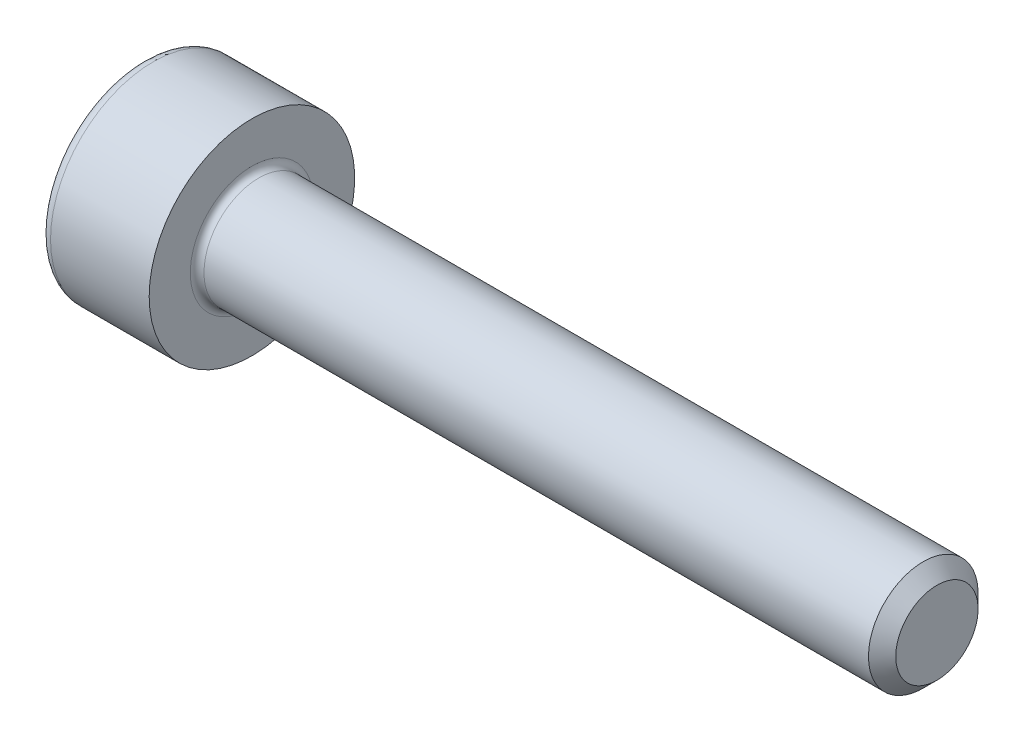
ISO-10303-21;
HEADER;
FILE_DESCRIPTION(('STEP AP214'),'2;1');
FILE_NAME('part.step','',(''),(''),'','','');
FILE_SCHEMA(('AUTOMOTIVE_DESIGN { 1 0 10303 214 1 1 1 1 }'));
ENDSEC;
DATA;
#1=APPLICATION_CONTEXT('core data for automotive mechanical design processes');
#2=APPLICATION_PROTOCOL_DEFINITION('international standard','automotive_design',2000,#1);
#3=PRODUCT_CONTEXT('',#1,'mechanical');
#4=PRODUCT('Part','Part','',(#3));
#5=PRODUCT_RELATED_PRODUCT_CATEGORY('part','',(#4));
#6=PRODUCT_DEFINITION_FORMATION('','',#4);
#7=PRODUCT_DEFINITION_CONTEXT('part definition',#1,'design');
#8=PRODUCT_DEFINITION('design','',#6,#7);
#9=PRODUCT_DEFINITION_SHAPE('','',#8);
#10=(LENGTH_UNIT() NAMED_UNIT(*) SI_UNIT(.MILLI.,.METRE.));
#11=(NAMED_UNIT(*) PLANE_ANGLE_UNIT() SI_UNIT($,.RADIAN.));
#12=(NAMED_UNIT(*) SI_UNIT($,.STERADIAN.) SOLID_ANGLE_UNIT());
#13=UNCERTAINTY_MEASURE_WITH_UNIT(LENGTH_MEASURE(1.E-05),#10,'distance_accuracy_value','');
#14=(GEOMETRIC_REPRESENTATION_CONTEXT(3) GLOBAL_UNCERTAINTY_ASSIGNED_CONTEXT((#13)) GLOBAL_UNIT_ASSIGNED_CONTEXT((#10,
#11,#12)) REPRESENTATION_CONTEXT('',''));
#15=CARTESIAN_POINT('',(0.,0.,0.));
#16=DIRECTION('',(0.,0.,1.));
#17=DIRECTION('',(1.,0.,0.));
#18=AXIS2_PLACEMENT_3D('',#15,#16,#17);
#19=CARTESIAN_POINT('',(0.,0.,0.));
#20=DIRECTION('',(-1.,0.,0.));
#21=DIRECTION('',(0.,0.,1.));
#22=AXIS2_PLACEMENT_3D('',#19,#20,#21);
#23=PLANE('',#22);
#24=DIRECTION('',(0.,-0.499999999999998,0.866025403784439));
#25=VECTOR('',#24,1.);
#26=CARTESIAN_POINT('',(0.,0.877572409168226,0.));
#27=LINE('',#26,#25);
#28=CARTESIAN_POINT('',(0.,0.877572409168226,0.));
#29=VERTEX_POINT('',#28);
#30=CARTESIAN_POINT('',(0.,0.438786204584112,0.759999999999998));
#31=VERTEX_POINT('',#30);
#32=EDGE_CURVE('E261',#29,#31,#27,.T.);
#33=ORIENTED_EDGE('',*,*,#32,.T.);
#34=DIRECTION('',(0.,1.,0.));
#35=VECTOR('',#34,1.);
#36=CARTESIAN_POINT('',(0.,-0.43878620458412,0.76));
#37=LINE('',#36,#35);
#38=CARTESIAN_POINT('',(0.,-0.43878620458412,0.76));
#39=VERTEX_POINT('',#38);
#40=EDGE_CURVE('E133',#39,#31,#37,.T.);
#41=ORIENTED_EDGE('',*,*,#40,.F.);
#42=DIRECTION('',(0.,-0.500000000000001,-0.866025403784438));
#43=VECTOR('',#42,1.);
#44=CARTESIAN_POINT('',(0.,-0.43878620458412,0.76));
#45=LINE('',#44,#43);
#46=CARTESIAN_POINT('',(0.,-0.877572409168237,0.));
#47=VERTEX_POINT('',#46);
#48=EDGE_CURVE('E264',#39,#47,#45,.T.);
#49=ORIENTED_EDGE('',*,*,#48,.T.);
#50=DIRECTION('',(0.,0.499999999999998,-0.866025403784439));
#51=VECTOR('',#50,1.);
#52=CARTESIAN_POINT('',(0.,-0.877572409168237,0.));
#53=LINE('',#52,#51);
#54=CARTESIAN_POINT('',(0.,-0.438786204584122,-0.760000000000002));
#55=VERTEX_POINT('',#54);
#56=EDGE_CURVE('E267',#47,#55,#53,.T.);
#57=ORIENTED_EDGE('',*,*,#56,.T.);
#58=DIRECTION('',(0.,-1.,0.));
#59=VECTOR('',#58,1.);
#60=CARTESIAN_POINT('',(0.,0.438786204584109,-0.760000000000003));
#61=LINE('',#60,#59);
#62=CARTESIAN_POINT('',(0.,0.438786204584109,-0.760000000000003));
#63=VERTEX_POINT('',#62);
#64=EDGE_CURVE('E270',#63,#55,#61,.T.);
#65=ORIENTED_EDGE('',*,*,#64,.F.);
#66=DIRECTION('',(0.,-0.500000000000001,-0.866025403784438));
#67=VECTOR('',#66,1.);
#68=CARTESIAN_POINT('',(0.,0.877572409168226,0.));
#69=LINE('',#68,#67);
#70=EDGE_CURVE('E128',#29,#63,#69,.T.);
#71=ORIENTED_EDGE('',*,*,#70,.F.);
#72=EDGE_LOOP('',(#33,#41,#49,#57,#65,#71));
#73=FACE_BOUND('',#72,.T.);
#74=CARTESIAN_POINT('',(0.,0.,0.));
#75=DIRECTION('',(-1.,0.,0.));
#76=DIRECTION('',(0.,0.,1.));
#77=AXIS2_PLACEMENT_3D('',#74,#75,#76);
#78=CIRCLE('',#77,1.34);
#79=CARTESIAN_POINT('',(0.,0.,1.34));
#80=VERTEX_POINT('',#79);
#81=EDGE_CURVE('E45',#80,#80,#78,.T.);
#82=ORIENTED_EDGE('',*,*,#81,.T.);
#83=EDGE_LOOP('',(#82));
#84=FACE_BOUND('',#83,.T.);
#85=ADVANCED_FACE('F37',(#73,#84),#23,.T.);
#86=CARTESIAN_POINT('',(-31.75,0.,0.));
#87=DIRECTION('',(-1.,0.,0.));
#88=DIRECTION('',(0.,0.,1.));
#89=AXIS2_PLACEMENT_3D('',#86,#87,#88);
#90=CYLINDRICAL_SURFACE('',#89,1.5);
#91=CARTESIAN_POINT('',(0.16,0.,0.));
#92=DIRECTION('',(-1.,0.,0.));
#93=DIRECTION('',(0.,0.,1.));
#94=AXIS2_PLACEMENT_3D('',#91,#92,#93);
#95=CIRCLE('',#94,1.5);
#96=CARTESIAN_POINT('',(0.16,0.,1.5));
#97=VERTEX_POINT('',#96);
#98=EDGE_CURVE('E11',#97,#97,#95,.F.);
#99=ORIENTED_EDGE('',*,*,#98,.T.);
#100=EDGE_LOOP('',(#99));
#101=FACE_BOUND('',#100,.T.);
#102=CARTESIAN_POINT('',(1.6,0.,0.));
#103=DIRECTION('',(-1.,0.,0.));
#104=DIRECTION('',(0.,0.,1.));
#105=AXIS2_PLACEMENT_3D('',#102,#103,#104);
#106=CIRCLE('',#105,1.5);
#107=CARTESIAN_POINT('',(1.6,0.,1.5));
#108=VERTEX_POINT('',#107);
#109=EDGE_CURVE('E151',#108,#108,#106,.T.);
#110=ORIENTED_EDGE('',*,*,#109,.T.);
#111=EDGE_LOOP('',(#110));
#112=FACE_BOUND('',#111,.T.);
#113=ADVANCED_FACE('F175',(#101,#112),#90,.T.);
#114=CARTESIAN_POINT('',(1.6,1.5,0.));
#115=DIRECTION('',(1.,0.,0.));
#116=DIRECTION('',(0.,0.,-1.));
#117=AXIS2_PLACEMENT_3D('',#114,#115,#116);
#118=PLANE('',#117);
#119=CARTESIAN_POINT('',(1.6,0.,0.));
#120=DIRECTION('',(1.,0.,0.));
#121=DIRECTION('',(0.,0.,-1.));
#122=AXIS2_PLACEMENT_3D('',#119,#120,#121);
#123=CIRCLE('',#122,0.899999999999996);
#124=CARTESIAN_POINT('',(1.6,0.,-0.899999999999996));
#125=VERTEX_POINT('',#124);
#126=EDGE_CURVE('E154',#125,#125,#123,.F.);
#127=ORIENTED_EDGE('',*,*,#126,.T.);
#128=EDGE_LOOP('',(#127));
#129=FACE_BOUND('',#128,.T.);
#130=ORIENTED_EDGE('',*,*,#109,.F.);
#131=EDGE_LOOP('',(#130));
#132=FACE_BOUND('',#131,.T.);
#133=ADVANCED_FACE('F181',(#129,#132),#118,.T.);
#134=CARTESIAN_POINT('',(-31.75,0.,0.));
#135=DIRECTION('',(-1.,0.,0.));
#136=DIRECTION('',(0.,0.,1.));
#137=AXIS2_PLACEMENT_3D('',#134,#135,#136);
#138=CYLINDRICAL_SURFACE('',#137,0.799999999999996);
#139=CARTESIAN_POINT('',(1.7,0.,0.));
#140=DIRECTION('',(1.,0.,0.));
#141=DIRECTION('',(0.,0.,-1.));
#142=AXIS2_PLACEMENT_3D('',#139,#140,#141);
#143=CIRCLE('',#142,0.799999999999996);
#144=CARTESIAN_POINT('',(1.7,0.,-0.799999999999996));
#145=VERTEX_POINT('',#144);
#146=EDGE_CURVE('E157',#145,#145,#143,.T.);
#147=ORIENTED_EDGE('',*,*,#146,.T.);
#148=EDGE_LOOP('',(#147));
#149=FACE_BOUND('',#148,.T.);
#150=CARTESIAN_POINT('',(11.401,0.,0.));
#151=DIRECTION('',(-1.,0.,0.));
#152=DIRECTION('',(0.,0.,1.));
#153=AXIS2_PLACEMENT_3D('',#150,#151,#152);
#154=CIRCLE('',#153,0.799999999999993);
#155=CARTESIAN_POINT('',(11.401,0.,0.799999999999993));
#156=VERTEX_POINT('',#155);
#157=EDGE_CURVE('E148',#156,#156,#154,.T.);
#158=ORIENTED_EDGE('',*,*,#157,.T.);
#159=EDGE_LOOP('',(#158));
#160=FACE_BOUND('',#159,.T.);
#161=ADVANCED_FACE('F187',(#149,#160),#138,.T.);
#162=CARTESIAN_POINT('',(11.6,0.,0.));
#163=DIRECTION('',(-1.,0.,0.));
#164=DIRECTION('',(0.,0.,1.));
#165=AXIS2_PLACEMENT_3D('',#162,#163,#164);
#166=CONICAL_SURFACE('',#165,0.601,0.785398163397419);
#167=ORIENTED_EDGE('',*,*,#157,.F.);
#168=EDGE_LOOP('',(#167));
#169=FACE_BOUND('',#168,.T.);
#170=CARTESIAN_POINT('',(11.6,0.,0.));
#171=DIRECTION('',(-1.,0.,0.));
#172=DIRECTION('',(0.,0.,1.));
#173=AXIS2_PLACEMENT_3D('',#170,#171,#172);
#174=CIRCLE('',#173,0.601);
#175=CARTESIAN_POINT('',(11.6,0.,0.601));
#176=VERTEX_POINT('',#175);
#177=EDGE_CURVE('E144',#176,#176,#174,.T.);
#178=ORIENTED_EDGE('',*,*,#177,.T.);
#179=EDGE_LOOP('',(#178));
#180=FACE_BOUND('',#179,.T.);
#181=ADVANCED_FACE('F191',(#169,#180),#166,.T.);
#182=CARTESIAN_POINT('',(11.6,0.601,0.));
#183=DIRECTION('',(1.,0.,0.));
#184=DIRECTION('',(0.,0.,-1.));
#185=AXIS2_PLACEMENT_3D('',#182,#183,#184);
#186=PLANE('',#185);
#187=ORIENTED_EDGE('',*,*,#177,.F.);
#188=EDGE_LOOP('',(#187));
#189=FACE_BOUND('',#188,.T.);
#190=ADVANCED_FACE('F171',(#189),#186,.T.);
#191=CARTESIAN_POINT('',(1.7,0.,0.));
#192=DIRECTION('',(1.,0.,0.));
#193=DIRECTION('',(0.,0.,-1.));
#194=AXIS2_PLACEMENT_3D('',#191,#192,#193);
#195=TOROIDAL_SURFACE('',#194,0.899999999999996,0.1);
#196=ORIENTED_EDGE('',*,*,#146,.F.);
#197=EDGE_LOOP('',(#196));
#198=FACE_BOUND('',#197,.T.);
#199=ORIENTED_EDGE('',*,*,#126,.F.);
#200=EDGE_LOOP('',(#199));
#201=FACE_BOUND('',#200,.T.);
#202=ADVANCED_FACE('F164',(#198,#201),#195,.F.);
#203=CARTESIAN_POINT('',(0.16,0.,0.));
#204=DIRECTION('',(-1.,0.,0.));
#205=DIRECTION('',(0.,0.,1.));
#206=AXIS2_PLACEMENT_3D('',#203,#204,#205);
#207=TOROIDAL_SURFACE('',#206,1.34,0.16);
#208=ORIENTED_EDGE('',*,*,#98,.F.);
#209=EDGE_LOOP('',(#208));
#210=FACE_BOUND('',#209,.T.);
#211=ORIENTED_EDGE('',*,*,#81,.F.);
#212=EDGE_LOOP('',(#211));
#213=FACE_BOUND('',#212,.T.);
#214=ADVANCED_FACE('F39',(#210,#213),#207,.T.);
#215=CARTESIAN_POINT('',(0.7,0.877572409168226,0.));
#216=DIRECTION('',(0.,-0.86602540378444,-0.499999999999998));
#217=DIRECTION('',(0.,0.499999999999998,-0.86602540378444));
#218=AXIS2_PLACEMENT_3D('',#215,#216,#217);
#219=PLANE('',#218);
#220=ORIENTED_EDGE('',*,*,#32,.F.);
#221=DIRECTION('',(-1.,0.,0.));
#222=VECTOR('',#221,1.);
#223=CARTESIAN_POINT('',(0.7,0.877572409168226,0.));
#224=LINE('',#223,#222);
#225=CARTESIAN_POINT('',(0.7,0.877572409168226,0.));
#226=VERTEX_POINT('',#225);
#227=EDGE_CURVE('E251',#226,#29,#224,.T.);
#228=ORIENTED_EDGE('',*,*,#227,.F.);
#229=DIRECTION('',(0.,-0.499999999999998,0.866025403784439));
#230=VECTOR('',#229,1.);
#231=CARTESIAN_POINT('',(0.7,0.877572409168226,0.));
#232=LINE('',#231,#230);
#233=CARTESIAN_POINT('',(0.7,0.65817930687617,0.379999999999996));
#234=VERTEX_POINT('',#233);
#235=EDGE_CURVE('E120',#226,#234,#232,.T.);
#236=ORIENTED_EDGE('',*,*,#235,.T.);
#237=CARTESIAN_POINT('',(0.7,0.438786204584112,0.759999999999998));
#238=VERTEX_POINT('',#237);
#239=EDGE_CURVE('E111',#234,#238,#232,.T.);
#240=ORIENTED_EDGE('',*,*,#239,.T.);
#241=DIRECTION('',(-1.,0.,0.));
#242=VECTOR('',#241,1.);
#243=CARTESIAN_POINT('',(0.7,0.438786204584112,0.759999999999998));
#244=LINE('',#243,#242);
#245=EDGE_CURVE('E125',#238,#31,#244,.T.);
#246=ORIENTED_EDGE('',*,*,#245,.T.);
#247=EDGE_LOOP('',(#220,#228,#236,#240,#246));
#248=FACE_BOUND('',#247,.T.);
#249=ADVANCED_FACE('F124',(#248),#219,.T.);
#250=CARTESIAN_POINT('',(0.7,-0.43878620458412,0.76));
#251=DIRECTION('',(0.,0.,1.));
#252=DIRECTION('',(0.,-1.,0.));
#253=AXIS2_PLACEMENT_3D('',#250,#251,#252);
#254=PLANE('',#253);
#255=ORIENTED_EDGE('',*,*,#40,.T.);
#256=ORIENTED_EDGE('',*,*,#245,.F.);
#257=DIRECTION('',(0.,1.,0.));
#258=VECTOR('',#257,1.);
#259=CARTESIAN_POINT('',(0.7,-0.43878620458412,0.76));
#260=LINE('',#259,#258);
#261=CARTESIAN_POINT('',(0.7,0.,0.759999999999999));
#262=VERTEX_POINT('',#261);
#263=EDGE_CURVE('E108',#262,#238,#260,.T.);
#264=ORIENTED_EDGE('',*,*,#263,.F.);
#265=CARTESIAN_POINT('',(0.7,-0.43878620458412,0.76));
#266=VERTEX_POINT('',#265);
#267=EDGE_CURVE('E119',#266,#262,#260,.T.);
#268=ORIENTED_EDGE('',*,*,#267,.F.);
#269=DIRECTION('',(-1.,0.,0.));
#270=VECTOR('',#269,1.);
#271=CARTESIAN_POINT('',(0.7,-0.43878620458412,0.76));
#272=LINE('',#271,#270);
#273=EDGE_CURVE('E135',#266,#39,#272,.T.);
#274=ORIENTED_EDGE('',*,*,#273,.T.);
#275=EDGE_LOOP('',(#255,#256,#264,#268,#274));
#276=FACE_BOUND('',#275,.T.);
#277=ADVANCED_FACE('F130',(#276),#254,.F.);
#278=CARTESIAN_POINT('',(0.7,-0.43878620458412,0.76));
#279=DIRECTION('',(0.,0.866025403784438,-0.500000000000001));
#280=DIRECTION('',(0.,0.500000000000001,0.866025403784438));
#281=AXIS2_PLACEMENT_3D('',#278,#279,#280);
#282=PLANE('',#281);
#283=ORIENTED_EDGE('',*,*,#48,.F.);
#284=ORIENTED_EDGE('',*,*,#273,.F.);
#285=DIRECTION('',(0.,-0.500000000000001,-0.866025403784438));
#286=VECTOR('',#285,1.);
#287=CARTESIAN_POINT('',(0.7,-0.43878620458412,0.76));
#288=LINE('',#287,#286);
#289=CARTESIAN_POINT('',(0.7,-0.658179306876177,0.380000000000003));
#290=VERTEX_POINT('',#289);
#291=EDGE_CURVE('E290',#266,#290,#288,.T.);
#292=ORIENTED_EDGE('',*,*,#291,.T.);
#293=CARTESIAN_POINT('',(0.7,-0.877572409168237,0.));
#294=VERTEX_POINT('',#293);
#295=EDGE_CURVE('E279',#290,#294,#288,.T.);
#296=ORIENTED_EDGE('',*,*,#295,.T.);
#297=DIRECTION('',(-1.,0.,0.));
#298=VECTOR('',#297,1.);
#299=CARTESIAN_POINT('',(0.7,-0.877572409168237,0.));
#300=LINE('',#299,#298);
#301=EDGE_CURVE('E140',#294,#47,#300,.T.);
#302=ORIENTED_EDGE('',*,*,#301,.T.);
#303=EDGE_LOOP('',(#283,#284,#292,#296,#302));
#304=FACE_BOUND('',#303,.T.);
#305=ADVANCED_FACE('F205',(#304),#282,.T.);
#306=CARTESIAN_POINT('',(0.7,-0.877572409168237,0.));
#307=DIRECTION('',(0.,0.86602540378444,0.499999999999998));
#308=DIRECTION('',(0.,-0.499999999999998,0.86602540378444));
#309=AXIS2_PLACEMENT_3D('',#306,#307,#308);
#310=PLANE('',#309);
#311=ORIENTED_EDGE('',*,*,#56,.F.);
#312=ORIENTED_EDGE('',*,*,#301,.F.);
#313=DIRECTION('',(0.,0.499999999999998,-0.866025403784439));
#314=VECTOR('',#313,1.);
#315=CARTESIAN_POINT('',(0.7,-0.877572409168237,0.));
#316=LINE('',#315,#314);
#317=CARTESIAN_POINT('',(0.7,-0.658179306876179,-0.380000000000002));
#318=VERTEX_POINT('',#317);
#319=EDGE_CURVE('E257',#294,#318,#316,.T.);
#320=ORIENTED_EDGE('',*,*,#319,.T.);
#321=CARTESIAN_POINT('',(0.7,-0.438786204584122,-0.760000000000002));
#322=VERTEX_POINT('',#321);
#323=EDGE_CURVE('E289',#318,#322,#316,.T.);
#324=ORIENTED_EDGE('',*,*,#323,.T.);
#325=DIRECTION('',(-1.,0.,0.));
#326=VECTOR('',#325,1.);
#327=CARTESIAN_POINT('',(0.7,-0.438786204584122,-0.760000000000002));
#328=LINE('',#327,#326);
#329=EDGE_CURVE('E250',#322,#55,#328,.T.);
#330=ORIENTED_EDGE('',*,*,#329,.T.);
#331=EDGE_LOOP('',(#311,#312,#320,#324,#330));
#332=FACE_BOUND('',#331,.T.);
#333=ADVANCED_FACE('F208',(#332),#310,.T.);
#334=CARTESIAN_POINT('',(0.7,0.438786204584109,-0.760000000000003));
#335=DIRECTION('',(0.,0.,-1.));
#336=DIRECTION('',(0.,1.,0.));
#337=AXIS2_PLACEMENT_3D('',#334,#335,#336);
#338=PLANE('',#337);
#339=ORIENTED_EDGE('',*,*,#64,.T.);
#340=ORIENTED_EDGE('',*,*,#329,.F.);
#341=DIRECTION('',(0.,-1.,0.));
#342=VECTOR('',#341,1.);
#343=CARTESIAN_POINT('',(0.7,0.438786204584109,-0.760000000000003));
#344=LINE('',#343,#342);
#345=CARTESIAN_POINT('',(0.7,0.,-0.76));
#346=VERTEX_POINT('',#345);
#347=EDGE_CURVE('E254',#346,#322,#344,.T.);
#348=ORIENTED_EDGE('',*,*,#347,.F.);
#349=CARTESIAN_POINT('',(0.7,0.438786204584109,-0.760000000000003));
#350=VERTEX_POINT('',#349);
#351=EDGE_CURVE('E52',#350,#346,#344,.T.);
#352=ORIENTED_EDGE('',*,*,#351,.F.);
#353=DIRECTION('',(-1.,0.,0.));
#354=VECTOR('',#353,1.);
#355=CARTESIAN_POINT('',(0.7,0.438786204584109,-0.760000000000003));
#356=LINE('',#355,#354);
#357=EDGE_CURVE('E247',#350,#63,#356,.T.);
#358=ORIENTED_EDGE('',*,*,#357,.T.);
#359=EDGE_LOOP('',(#339,#340,#348,#352,#358));
#360=FACE_BOUND('',#359,.T.);
#361=ADVANCED_FACE('F212',(#360),#338,.F.);
#362=CARTESIAN_POINT('',(0.7,0.877572409168226,0.));
#363=DIRECTION('',(0.,0.866025403784438,-0.500000000000001));
#364=DIRECTION('',(0.,0.500000000000001,0.866025403784438));
#365=AXIS2_PLACEMENT_3D('',#362,#363,#364);
#366=PLANE('',#365);
#367=ORIENTED_EDGE('',*,*,#70,.T.);
#368=ORIENTED_EDGE('',*,*,#357,.F.);
#369=DIRECTION('',(0.,-0.500000000000001,-0.866025403784438));
#370=VECTOR('',#369,1.);
#371=CARTESIAN_POINT('',(0.7,0.877572409168226,0.));
#372=LINE('',#371,#370);
#373=CARTESIAN_POINT('',(0.7,0.65817930687617,-0.379999999999999));
#374=VERTEX_POINT('',#373);
#375=EDGE_CURVE('E237',#374,#350,#372,.T.);
#376=ORIENTED_EDGE('',*,*,#375,.F.);
#377=EDGE_CURVE('E243',#226,#374,#372,.T.);
#378=ORIENTED_EDGE('',*,*,#377,.F.);
#379=ORIENTED_EDGE('',*,*,#227,.T.);
#380=EDGE_LOOP('',(#367,#368,#376,#378,#379));
#381=FACE_BOUND('',#380,.T.);
#382=ADVANCED_FACE('F216',(#381),#366,.F.);
#383=CARTESIAN_POINT('',(0.7,1.31635861375234,-0.760000000000004));
#384=DIRECTION('',(1.,0.,0.));
#385=DIRECTION('',(0.,0.,-1.));
#386=AXIS2_PLACEMENT_3D('',#383,#384,#385);
#387=PLANE('',#386);
#388=ORIENTED_EDGE('',*,*,#347,.T.);
#389=ORIENTED_EDGE('',*,*,#323,.F.);
#390=CARTESIAN_POINT('',(0.7,0.,0.));
#391=DIRECTION('',(-1.,0.,0.));
#392=DIRECTION('',(0.,0.,1.));
#393=AXIS2_PLACEMENT_3D('',#390,#391,#392);
#394=CIRCLE('',#393,0.76);
#395=EDGE_CURVE('E285',#346,#318,#394,.T.);
#396=ORIENTED_EDGE('',*,*,#395,.F.);
#397=EDGE_LOOP('',(#388,#389,#396));
#398=FACE_BOUND('',#397,.T.);
#399=ADVANCED_FACE('F220',(#398),#387,.F.);
#400=ORIENTED_EDGE('',*,*,#319,.F.);
#401=ORIENTED_EDGE('',*,*,#295,.F.);
#402=EDGE_CURVE('E138',#318,#290,#394,.T.);
#403=ORIENTED_EDGE('',*,*,#402,.F.);
#404=EDGE_LOOP('',(#400,#401,#403));
#405=FACE_BOUND('',#404,.T.);
#406=ADVANCED_FACE('F223',(#405),#387,.F.);
#407=ORIENTED_EDGE('',*,*,#291,.F.);
#408=ORIENTED_EDGE('',*,*,#267,.T.);
#409=EDGE_CURVE('E134',#290,#262,#394,.T.);
#410=ORIENTED_EDGE('',*,*,#409,.F.);
#411=EDGE_LOOP('',(#407,#408,#410));
#412=FACE_BOUND('',#411,.T.);
#413=ADVANCED_FACE('F228',(#412),#387,.F.);
#414=ORIENTED_EDGE('',*,*,#263,.T.);
#415=ORIENTED_EDGE('',*,*,#239,.F.);
#416=EDGE_CURVE('E114',#262,#234,#394,.T.);
#417=ORIENTED_EDGE('',*,*,#416,.F.);
#418=EDGE_LOOP('',(#414,#415,#417));
#419=FACE_BOUND('',#418,.T.);
#420=ADVANCED_FACE('F110',(#419),#387,.F.);
#421=ORIENTED_EDGE('',*,*,#235,.F.);
#422=ORIENTED_EDGE('',*,*,#377,.T.);
#423=EDGE_CURVE('E145',#234,#374,#394,.T.);
#424=ORIENTED_EDGE('',*,*,#423,.F.);
#425=EDGE_LOOP('',(#421,#422,#424));
#426=FACE_BOUND('',#425,.T.);
#427=ADVANCED_FACE('F231',(#426),#387,.F.);
#428=ORIENTED_EDGE('',*,*,#375,.T.);
#429=ORIENTED_EDGE('',*,*,#351,.T.);
#430=EDGE_CURVE('E240',#374,#346,#394,.T.);
#431=ORIENTED_EDGE('',*,*,#430,.F.);
#432=EDGE_LOOP('',(#428,#429,#431));
#433=FACE_BOUND('',#432,.T.);
#434=ADVANCED_FACE('F201',(#433),#387,.F.);
#435=CARTESIAN_POINT('',(0.7,0.,0.));
#436=DIRECTION('',(-1.,0.,0.));
#437=DIRECTION('',(0.,0.,1.));
#438=AXIS2_PLACEMENT_3D('',#435,#436,#437);
#439=CONICAL_SURFACE('',#438,0.76,1.0471975511966);
#440=CARTESIAN_POINT('',(1.13878620458412,0.,0.));
#441=VERTEX_POINT('',#440);
#442=VERTEX_LOOP('',#441);
#443=FACE_BOUND('',#442,.T.);
#444=ORIENTED_EDGE('',*,*,#416,.T.);
#445=ORIENTED_EDGE('',*,*,#423,.T.);
#446=ORIENTED_EDGE('',*,*,#430,.T.);
#447=ORIENTED_EDGE('',*,*,#395,.T.);
#448=ORIENTED_EDGE('',*,*,#402,.T.);
#449=ORIENTED_EDGE('',*,*,#409,.T.);
#450=EDGE_LOOP('',(#444,#445,#446,#447,#448,#449));
#451=FACE_BOUND('',#450,.T.);
#452=ADVANCED_FACE('F199',(#443,#451),#439,.F.);
#453=CLOSED_SHELL('',(#85,#113,#133,#161,#181,#190,#202,#214,#249,#277,#305,#333,#361,#382,#399,
#406,#413,#420,#427,#434,#452));
#454=MANIFOLD_SOLID_BREP('B2',#453);
#455=ADVANCED_BREP_SHAPE_REPRESENTATION('',(#18,#454),#14);
#456=SHAPE_DEFINITION_REPRESENTATION(#9,#455);
ENDSEC;
END-ISO-10303-21;
